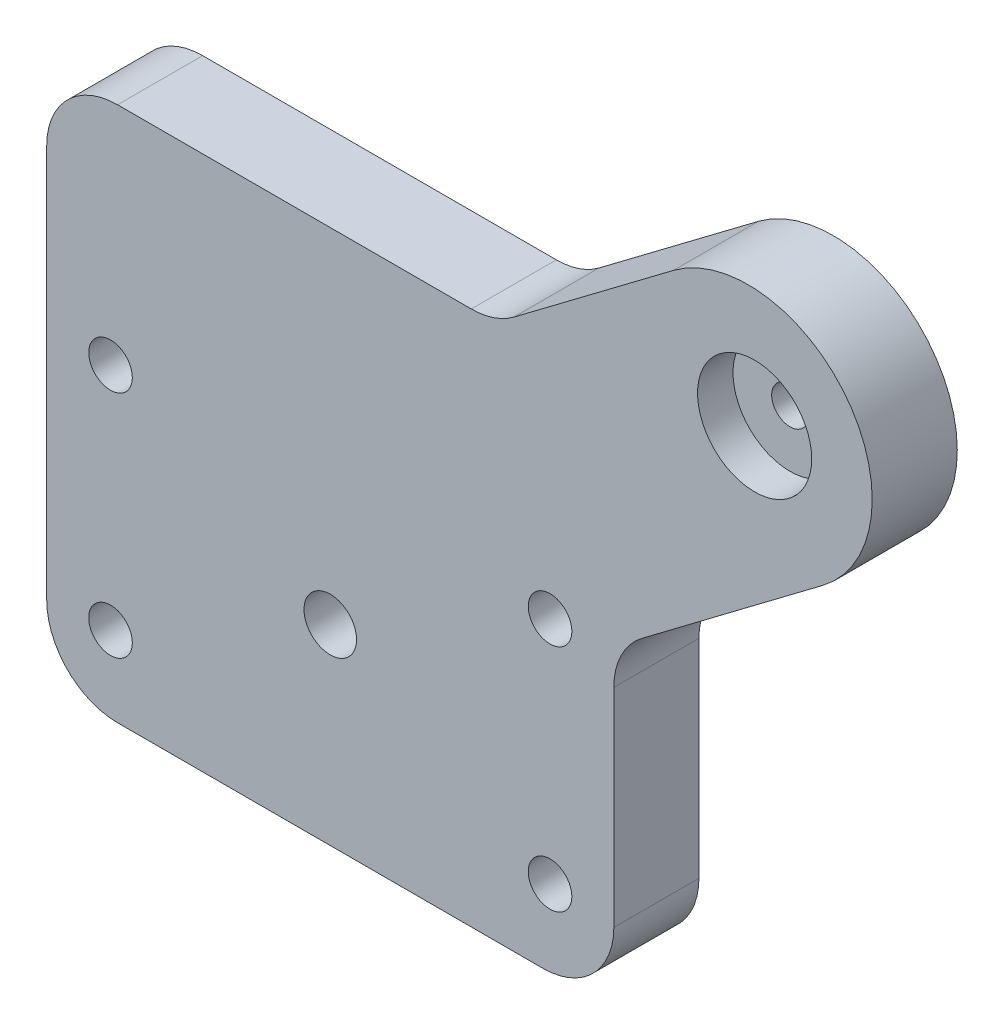
ISO-10303-21;
HEADER;
FILE_DESCRIPTION(('STEP AP214'),'2;1');
FILE_NAME('part.step','',(''),(''),'','','');
FILE_SCHEMA(('AUTOMOTIVE_DESIGN { 1 0 10303 214 1 1 1 1 }'));
ENDSEC;
DATA;
#1=APPLICATION_CONTEXT('core data for automotive mechanical design processes');
#2=APPLICATION_PROTOCOL_DEFINITION('international standard','automotive_design',2000,#1);
#3=PRODUCT_CONTEXT('',#1,'mechanical');
#4=PRODUCT('Part','Part','',(#3));
#5=PRODUCT_RELATED_PRODUCT_CATEGORY('part','',(#4));
#6=PRODUCT_DEFINITION_FORMATION('','',#4);
#7=PRODUCT_DEFINITION_CONTEXT('part definition',#1,'design');
#8=PRODUCT_DEFINITION('design','',#6,#7);
#9=PRODUCT_DEFINITION_SHAPE('','',#8);
#10=(LENGTH_UNIT() NAMED_UNIT(*) SI_UNIT(.MILLI.,.METRE.));
#11=(NAMED_UNIT(*) PLANE_ANGLE_UNIT() SI_UNIT($,.RADIAN.));
#12=(NAMED_UNIT(*) SI_UNIT($,.STERADIAN.) SOLID_ANGLE_UNIT());
#13=UNCERTAINTY_MEASURE_WITH_UNIT(LENGTH_MEASURE(1.E-05),#10,'distance_accuracy_value','');
#14=(GEOMETRIC_REPRESENTATION_CONTEXT(3) GLOBAL_UNCERTAINTY_ASSIGNED_CONTEXT((#13)) GLOBAL_UNIT_ASSIGNED_CONTEXT((#10,
#11,#12)) REPRESENTATION_CONTEXT('',''));
#15=CARTESIAN_POINT('',(0.,0.,0.));
#16=DIRECTION('',(0.,0.,1.));
#17=DIRECTION('',(1.,0.,0.));
#18=AXIS2_PLACEMENT_3D('',#15,#16,#17);
#19=CARTESIAN_POINT('',(58.9473260814253,242.5,14.));
#20=DIRECTION('',(0.,0.,1.));
#21=DIRECTION('',(1.,0.,0.));
#22=AXIS2_PLACEMENT_3D('',#19,#20,#21);
#23=CYLINDRICAL_SURFACE('',#22,17.5000000000002);
#24=CARTESIAN_POINT('',(58.9473260814253,242.5,26.));
#25=DIRECTION('',(0.,0.,1.));
#26=DIRECTION('',(1.,0.,0.));
#27=AXIS2_PLACEMENT_3D('',#24,#25,#26);
#28=CIRCLE('',#27,17.5000000000002);
#29=CARTESIAN_POINT('',(69.4790889865861,228.523878574172,26.));
#30=VERTEX_POINT('',#29);
#31=CARTESIAN_POINT('',(48.4155631762644,256.476121425828,26.));
#32=VERTEX_POINT('',#31);
#33=EDGE_CURVE('E164',#30,#32,#28,.T.);
#34=ORIENTED_EDGE('',*,*,#33,.F.);
#35=DIRECTION('',(0.,0.,1.));
#36=VECTOR('',#35,1.);
#37=CARTESIAN_POINT('',(69.4790889865861,228.523878574172,14.));
#38=LINE('',#37,#36);
#39=CARTESIAN_POINT('',(69.4790889865861,228.523878574172,14.));
#40=VERTEX_POINT('',#39);
#41=EDGE_CURVE('E133',#40,#30,#38,.T.);
#42=ORIENTED_EDGE('',*,*,#41,.F.);
#43=CARTESIAN_POINT('',(58.9473260814253,242.5,14.));
#44=DIRECTION('',(0.,0.,1.));
#45=DIRECTION('',(1.,0.,0.));
#46=AXIS2_PLACEMENT_3D('',#43,#44,#45);
#47=CIRCLE('',#46,17.5000000000002);
#48=CARTESIAN_POINT('',(48.4155631762644,256.476121425828,14.));
#49=VERTEX_POINT('',#48);
#50=EDGE_CURVE('E140',#40,#49,#47,.T.);
#51=ORIENTED_EDGE('',*,*,#50,.T.);
#52=DIRECTION('',(0.,0.,1.));
#53=VECTOR('',#52,1.);
#54=CARTESIAN_POINT('',(48.4155631762644,256.476121425828,14.));
#55=LINE('',#54,#53);
#56=EDGE_CURVE('E122',#49,#32,#55,.T.);
#57=ORIENTED_EDGE('',*,*,#56,.T.);
#58=EDGE_LOOP('',(#34,#42,#51,#57));
#59=FACE_BOUND('',#58,.T.);
#60=ADVANCED_FACE('F33',(#59),#23,.T.);
#61=CARTESIAN_POINT('',(40.0000000000002,206.309791674989,14.));
#62=DIRECTION('',(0.601815023152054,-0.798635510047288,0.));
#63=DIRECTION('',(0.798635510047288,0.601815023152054,0.));
#64=AXIS2_PLACEMENT_3D('',#61,#62,#63);
#65=PLANE('',#64);
#66=DIRECTION('',(0.798635510047288,0.601815023152054,0.));
#67=VECTOR('',#66,1.);
#68=CARTESIAN_POINT('',(40.0000000000002,206.309791674989,26.));
#69=LINE('',#68,#67);
#70=CARTESIAN_POINT('',(43.9818497684796,209.310330694928,26.));
#71=VERTEX_POINT('',#70);
#72=EDGE_CURVE('E145',#71,#30,#69,.T.);
#73=ORIENTED_EDGE('',*,*,#72,.F.);
#74=DIRECTION('',(0.,0.,1.));
#75=VECTOR('',#74,1.);
#76=CARTESIAN_POINT('',(43.9818497684797,209.310330694928,14.));
#77=LINE('',#76,#75);
#78=CARTESIAN_POINT('',(43.9818497684796,209.310330694928,14.));
#79=VERTEX_POINT('',#78);
#80=EDGE_CURVE('E185',#71,#79,#77,.F.);
#81=ORIENTED_EDGE('',*,*,#80,.T.);
#82=DIRECTION('',(0.798635510047288,0.601815023152054,0.));
#83=VECTOR('',#82,1.);
#84=CARTESIAN_POINT('',(40.0000000000002,206.309791674989,14.));
#85=LINE('',#84,#83);
#86=EDGE_CURVE('E134',#79,#40,#85,.T.);
#87=ORIENTED_EDGE('',*,*,#86,.T.);
#88=ORIENTED_EDGE('',*,*,#41,.T.);
#89=EDGE_LOOP('',(#73,#81,#87,#88));
#90=FACE_BOUND('',#89,.T.);
#91=ADVANCED_FACE('F240',(#90),#65,.T.);
#92=CARTESIAN_POINT('',(40.0000000000002,162.,14.));
#93=DIRECTION('',(1.,0.,0.));
#94=DIRECTION('',(0.,0.,-1.));
#95=AXIS2_PLACEMENT_3D('',#92,#93,#94);
#96=PLANE('',#95);
#97=DIRECTION('',(0.,1.,0.));
#98=VECTOR('',#97,1.);
#99=CARTESIAN_POINT('',(40.0000000000002,162.,14.));
#100=LINE('',#99,#98);
#101=CARTESIAN_POINT('',(40.0000000000002,172.,14.));
#102=VERTEX_POINT('',#101);
#103=CARTESIAN_POINT('',(40.0000000000002,201.323975594455,14.));
#104=VERTEX_POINT('',#103);
#105=EDGE_CURVE('E160',#102,#104,#100,.T.);
#106=ORIENTED_EDGE('',*,*,#105,.T.);
#107=DIRECTION('',(0.,0.,1.));
#108=VECTOR('',#107,1.);
#109=CARTESIAN_POINT('',(40.0000000000002,201.323975594455,26.));
#110=LINE('',#109,#108);
#111=CARTESIAN_POINT('',(40.0000000000002,201.323975594455,26.));
#112=VERTEX_POINT('',#111);
#113=EDGE_CURVE('E182',#104,#112,#110,.T.);
#114=ORIENTED_EDGE('',*,*,#113,.T.);
#115=DIRECTION('',(0.,1.,0.));
#116=VECTOR('',#115,1.);
#117=CARTESIAN_POINT('',(40.0000000000002,162.,26.));
#118=LINE('',#117,#116);
#119=CARTESIAN_POINT('',(40.0000000000002,172.,26.));
#120=VERTEX_POINT('',#119);
#121=EDGE_CURVE('E147',#120,#112,#118,.T.);
#122=ORIENTED_EDGE('',*,*,#121,.F.);
#123=DIRECTION('',(0.,0.,1.));
#124=VECTOR('',#123,1.);
#125=CARTESIAN_POINT('',(40.0000000000002,172.,14.));
#126=LINE('',#125,#124);
#127=EDGE_CURVE('E179',#120,#102,#126,.F.);
#128=ORIENTED_EDGE('',*,*,#127,.T.);
#129=EDGE_LOOP('',(#106,#114,#122,#128));
#130=FACE_BOUND('',#129,.T.);
#131=ADVANCED_FACE('F245',(#130),#96,.T.);
#132=CARTESIAN_POINT('',(-40.0000000000002,162.,14.));
#133=DIRECTION('',(0.,-1.,0.));
#134=DIRECTION('',(0.,0.,-1.));
#135=AXIS2_PLACEMENT_3D('',#132,#133,#134);
#136=PLANE('',#135);
#137=DIRECTION('',(1.,0.,0.));
#138=VECTOR('',#137,1.);
#139=CARTESIAN_POINT('',(-40.0000000000002,162.,26.));
#140=LINE('',#139,#138);
#141=CARTESIAN_POINT('',(-30.0000000000002,162.,26.));
#142=VERTEX_POINT('',#141);
#143=CARTESIAN_POINT('',(30.0000000000002,162.,26.));
#144=VERTEX_POINT('',#143);
#145=EDGE_CURVE('E174',#142,#144,#140,.T.);
#146=ORIENTED_EDGE('',*,*,#145,.F.);
#147=DIRECTION('',(0.,0.,1.));
#148=VECTOR('',#147,1.);
#149=CARTESIAN_POINT('',(-30.0000000000002,162.,14.));
#150=LINE('',#149,#148);
#151=CARTESIAN_POINT('',(-30.0000000000002,162.,14.));
#152=VERTEX_POINT('',#151);
#153=EDGE_CURVE('E213',#142,#152,#150,.F.);
#154=ORIENTED_EDGE('',*,*,#153,.T.);
#155=DIRECTION('',(1.,0.,0.));
#156=VECTOR('',#155,1.);
#157=CARTESIAN_POINT('',(-40.0000000000002,162.,14.));
#158=LINE('',#157,#156);
#159=CARTESIAN_POINT('',(30.0000000000002,162.,14.));
#160=VERTEX_POINT('',#159);
#161=EDGE_CURVE('E158',#152,#160,#158,.T.);
#162=ORIENTED_EDGE('',*,*,#161,.T.);
#163=DIRECTION('',(0.,0.,1.));
#164=VECTOR('',#163,1.);
#165=CARTESIAN_POINT('',(30.0000000000002,162.,14.));
#166=LINE('',#165,#164);
#167=EDGE_CURVE('E210',#160,#144,#166,.T.);
#168=ORIENTED_EDGE('',*,*,#167,.T.);
#169=EDGE_LOOP('',(#146,#154,#162,#168));
#170=FACE_BOUND('',#169,.T.);
#171=ADVANCED_FACE('F270',(#170),#136,.T.);
#172=CARTESIAN_POINT('',(-40.0000000000002,237.5,14.));
#173=DIRECTION('',(-1.,0.,0.));
#174=DIRECTION('',(0.,0.,1.));
#175=AXIS2_PLACEMENT_3D('',#172,#173,#174);
#176=PLANE('',#175);
#177=DIRECTION('',(0.,-1.,0.));
#178=VECTOR('',#177,1.);
#179=CARTESIAN_POINT('',(-40.0000000000002,237.5,26.));
#180=LINE('',#179,#178);
#181=CARTESIAN_POINT('',(-40.0000000000002,227.5,26.));
#182=VERTEX_POINT('',#181);
#183=CARTESIAN_POINT('',(-40.0000000000002,172.,26.));
#184=VERTEX_POINT('',#183);
#185=EDGE_CURVE('E171',#182,#184,#180,.T.);
#186=ORIENTED_EDGE('',*,*,#185,.F.);
#187=DIRECTION('',(0.,0.,1.));
#188=VECTOR('',#187,1.);
#189=CARTESIAN_POINT('',(-40.0000000000002,227.5,14.));
#190=LINE('',#189,#188);
#191=CARTESIAN_POINT('',(-40.0000000000002,227.5,14.));
#192=VERTEX_POINT('',#191);
#193=EDGE_CURVE('E201',#182,#192,#190,.F.);
#194=ORIENTED_EDGE('',*,*,#193,.T.);
#195=DIRECTION('',(0.,-1.,0.));
#196=VECTOR('',#195,1.);
#197=CARTESIAN_POINT('',(-40.0000000000002,237.5,14.));
#198=LINE('',#197,#196);
#199=CARTESIAN_POINT('',(-40.0000000000002,172.,14.));
#200=VERTEX_POINT('',#199);
#201=EDGE_CURVE('E155',#192,#200,#198,.T.);
#202=ORIENTED_EDGE('',*,*,#201,.T.);
#203=DIRECTION('',(0.,0.,1.));
#204=VECTOR('',#203,1.);
#205=CARTESIAN_POINT('',(-40.0000000000002,172.,14.));
#206=LINE('',#205,#204);
#207=EDGE_CURVE('E198',#200,#184,#206,.T.);
#208=ORIENTED_EDGE('',*,*,#207,.T.);
#209=EDGE_LOOP('',(#186,#194,#202,#208));
#210=FACE_BOUND('',#209,.T.);
#211=ADVANCED_FACE('F276',(#210),#176,.T.);
#212=CARTESIAN_POINT('',(23.2333995036793,237.5,14.));
#213=DIRECTION('',(0.,1.,0.));
#214=DIRECTION('',(0.,0.,1.));
#215=AXIS2_PLACEMENT_3D('',#212,#213,#214);
#216=PLANE('',#215);
#217=DIRECTION('',(-1.,0.,0.));
#218=VECTOR('',#217,1.);
#219=CARTESIAN_POINT('',(23.2333995036793,237.5,14.));
#220=LINE('',#219,#218);
#221=CARTESIAN_POINT('',(19.8874463086586,237.5,14.));
#222=VERTEX_POINT('',#221);
#223=CARTESIAN_POINT('',(-30.0000000000002,237.5,14.));
#224=VERTEX_POINT('',#223);
#225=EDGE_CURVE('E141',#222,#224,#220,.T.);
#226=ORIENTED_EDGE('',*,*,#225,.T.);
#227=DIRECTION('',(0.,0.,1.));
#228=VECTOR('',#227,1.);
#229=CARTESIAN_POINT('',(-30.0000000000002,237.5,14.));
#230=LINE('',#229,#228);
#231=CARTESIAN_POINT('',(-30.0000000000002,237.5,26.));
#232=VERTEX_POINT('',#231);
#233=EDGE_CURVE('E189',#224,#232,#230,.T.);
#234=ORIENTED_EDGE('',*,*,#233,.T.);
#235=DIRECTION('',(-1.,0.,0.));
#236=VECTOR('',#235,1.);
#237=CARTESIAN_POINT('',(23.2333995036793,237.5,26.));
#238=LINE('',#237,#236);
#239=CARTESIAN_POINT('',(19.8874463086586,237.5,26.));
#240=VERTEX_POINT('',#239);
#241=EDGE_CURVE('E168',#240,#232,#238,.T.);
#242=ORIENTED_EDGE('',*,*,#241,.F.);
#243=DIRECTION('',(0.,0.,1.));
#244=VECTOR('',#243,1.);
#245=CARTESIAN_POINT('',(19.8874463086586,237.5,14.));
#246=LINE('',#245,#244);
#247=EDGE_CURVE('E187',#240,#222,#246,.F.);
#248=ORIENTED_EDGE('',*,*,#247,.T.);
#249=EDGE_LOOP('',(#226,#234,#242,#248));
#250=FACE_BOUND('',#249,.T.);
#251=ADVANCED_FACE('F224',(#250),#216,.T.);
#252=CARTESIAN_POINT('',(48.4155631762644,256.476121425828,14.));
#253=DIRECTION('',(-0.601815023152049,0.798635510047292,0.));
#254=DIRECTION('',(-0.798635510047292,-0.601815023152049,0.));
#255=AXIS2_PLACEMENT_3D('',#252,#253,#254);
#256=PLANE('',#255);
#257=DIRECTION('',(-0.798635510047292,-0.601815023152049,0.));
#258=VECTOR('',#257,1.);
#259=CARTESIAN_POINT('',(48.4155631762644,256.476121425828,14.));
#260=LINE('',#259,#258);
#261=CARTESIAN_POINT('',(25.9055965401791,239.513644899527,14.));
#262=VERTEX_POINT('',#261);
#263=EDGE_CURVE('E125',#49,#262,#260,.T.);
#264=ORIENTED_EDGE('',*,*,#263,.T.);
#265=DIRECTION('',(0.,0.,1.));
#266=VECTOR('',#265,1.);
#267=CARTESIAN_POINT('',(25.9055965401791,239.513644899527,26.));
#268=LINE('',#267,#266);
#269=CARTESIAN_POINT('',(25.9055965401791,239.513644899527,26.));
#270=VERTEX_POINT('',#269);
#271=EDGE_CURVE('E208',#262,#270,#268,.T.);
#272=ORIENTED_EDGE('',*,*,#271,.T.);
#273=DIRECTION('',(-0.798635510047292,-0.601815023152049,0.));
#274=VECTOR('',#273,1.);
#275=CARTESIAN_POINT('',(48.4155631762644,256.476121425828,26.));
#276=LINE('',#275,#274);
#277=EDGE_CURVE('E128',#32,#270,#276,.T.);
#278=ORIENTED_EDGE('',*,*,#277,.F.);
#279=ORIENTED_EDGE('',*,*,#56,.F.);
#280=EDGE_LOOP('',(#264,#272,#278,#279));
#281=FACE_BOUND('',#280,.T.);
#282=ADVANCED_FACE('F123',(#281),#256,.T.);
#283=CARTESIAN_POINT('',(58.9473260814253,242.5,14.));
#284=DIRECTION('',(0.,0.,1.));
#285=DIRECTION('',(1.,0.,0.));
#286=AXIS2_PLACEMENT_3D('',#283,#284,#285);
#287=PLANE('',#286);
#288=CARTESIAN_POINT('',(59.8577432645162,243.186048555602,14.));
#289=DIRECTION('',(0.,0.,1.));
#290=DIRECTION('',(1.,0.,0.));
#291=AXIS2_PLACEMENT_3D('',#288,#289,#290);
#292=CIRCLE('',#291,2.59999999999999);
#293=CARTESIAN_POINT('',(62.4577432645162,243.186048555602,14.));
#294=VERTEX_POINT('',#293);
#295=EDGE_CURVE('E329',#294,#294,#292,.T.);
#296=ORIENTED_EDGE('',*,*,#295,.T.);
#297=EDGE_LOOP('',(#296));
#298=FACE_BOUND('',#297,.T.);
#299=CARTESIAN_POINT('',(30.9999999999999,172.8,14.));
#300=DIRECTION('',(0.,0.,1.));
#301=DIRECTION('',(1.,0.,0.));
#302=AXIS2_PLACEMENT_3D('',#299,#300,#301);
#303=CIRCLE('',#302,3.075);
#304=CARTESIAN_POINT('',(34.0749999999999,172.8,14.));
#305=VERTEX_POINT('',#304);
#306=EDGE_CURVE('E342',#305,#305,#303,.T.);
#307=ORIENTED_EDGE('',*,*,#306,.T.);
#308=EDGE_LOOP('',(#307));
#309=FACE_BOUND('',#308,.T.);
#310=CARTESIAN_POINT('',(-31.0000000000002,205.2,14.));
#311=DIRECTION('',(0.,0.,1.));
#312=DIRECTION('',(1.,0.,0.));
#313=AXIS2_PLACEMENT_3D('',#310,#311,#312);
#314=CIRCLE('',#313,3.075);
#315=CARTESIAN_POINT('',(-27.9250000000002,205.2,14.));
#316=VERTEX_POINT('',#315);
#317=EDGE_CURVE('E348',#316,#316,#314,.T.);
#318=ORIENTED_EDGE('',*,*,#317,.T.);
#319=EDGE_LOOP('',(#318));
#320=FACE_BOUND('',#319,.T.);
#321=CARTESIAN_POINT('',(-31.0000000000001,172.8,14.));
#322=DIRECTION('',(0.,0.,1.));
#323=DIRECTION('',(1.,0.,0.));
#324=AXIS2_PLACEMENT_3D('',#321,#322,#323);
#325=CIRCLE('',#324,3.075);
#326=CARTESIAN_POINT('',(-27.9250000000001,172.8,14.));
#327=VERTEX_POINT('',#326);
#328=EDGE_CURVE('E354',#327,#327,#325,.T.);
#329=ORIENTED_EDGE('',*,*,#328,.T.);
#330=EDGE_LOOP('',(#329));
#331=FACE_BOUND('',#330,.T.);
#332=CARTESIAN_POINT('',(30.9999999999998,205.2,14.));
#333=DIRECTION('',(0.,0.,1.));
#334=DIRECTION('',(1.,0.,0.));
#335=AXIS2_PLACEMENT_3D('',#332,#333,#334);
#336=CIRCLE('',#335,3.075);
#337=CARTESIAN_POINT('',(34.0749999999998,205.2,14.));
#338=VERTEX_POINT('',#337);
#339=EDGE_CURVE('E360',#338,#338,#336,.T.);
#340=ORIENTED_EDGE('',*,*,#339,.T.);
#341=EDGE_LOOP('',(#340));
#342=FACE_BOUND('',#341,.T.);
#343=CARTESIAN_POINT('',(0.,189.,14.));
#344=DIRECTION('',(0.,0.,1.));
#345=DIRECTION('',(1.,0.,0.));
#346=AXIS2_PLACEMENT_3D('',#343,#344,#345);
#347=CIRCLE('',#346,3.706733851603);
#348=CARTESIAN_POINT('',(3.70673385160301,189.,14.));
#349=VERTEX_POINT('',#348);
#350=EDGE_CURVE('E166',#349,#349,#347,.T.);
#351=ORIENTED_EDGE('',*,*,#350,.T.);
#352=EDGE_LOOP('',(#351));
#353=FACE_BOUND('',#352,.T.);
#354=ORIENTED_EDGE('',*,*,#201,.F.);
#355=CARTESIAN_POINT('',(-30.0000000000002,227.5,14.));
#356=DIRECTION('',(0.,0.,1.));
#357=DIRECTION('',(1.,0.,0.));
#358=AXIS2_PLACEMENT_3D('',#355,#356,#357);
#359=CIRCLE('',#358,10.);
#360=EDGE_CURVE('E206',#192,#224,#359,.F.);
#361=ORIENTED_EDGE('',*,*,#360,.T.);
#362=ORIENTED_EDGE('',*,*,#225,.F.);
#363=CARTESIAN_POINT('',(19.8874463086586,247.5,14.));
#364=DIRECTION('',(0.,0.,1.));
#365=DIRECTION('',(1.,0.,0.));
#366=AXIS2_PLACEMENT_3D('',#363,#364,#365);
#367=CIRCLE('',#366,10.);
#368=EDGE_CURVE('E11',#222,#262,#367,.T.);
#369=ORIENTED_EDGE('',*,*,#368,.T.);
#370=ORIENTED_EDGE('',*,*,#263,.F.);
#371=ORIENTED_EDGE('',*,*,#50,.F.);
#372=ORIENTED_EDGE('',*,*,#86,.F.);
#373=CARTESIAN_POINT('',(50.0000000000002,201.323975594455,14.));
#374=DIRECTION('',(0.,0.,1.));
#375=DIRECTION('',(1.,0.,0.));
#376=AXIS2_PLACEMENT_3D('',#373,#374,#375);
#377=CIRCLE('',#376,10.);
#378=EDGE_CURVE('E217',#79,#104,#377,.T.);
#379=ORIENTED_EDGE('',*,*,#378,.T.);
#380=ORIENTED_EDGE('',*,*,#105,.F.);
#381=CARTESIAN_POINT('',(30.0000000000002,172.,14.));
#382=DIRECTION('',(0.,0.,1.));
#383=DIRECTION('',(1.,0.,0.));
#384=AXIS2_PLACEMENT_3D('',#381,#382,#383);
#385=CIRCLE('',#384,10.);
#386=EDGE_CURVE('E53',#102,#160,#385,.F.);
#387=ORIENTED_EDGE('',*,*,#386,.T.);
#388=ORIENTED_EDGE('',*,*,#161,.F.);
#389=CARTESIAN_POINT('',(-30.0000000000002,172.,14.));
#390=DIRECTION('',(0.,0.,1.));
#391=DIRECTION('',(1.,0.,0.));
#392=AXIS2_PLACEMENT_3D('',#389,#390,#391);
#393=CIRCLE('',#392,10.);
#394=EDGE_CURVE('E204',#152,#200,#393,.F.);
#395=ORIENTED_EDGE('',*,*,#394,.T.);
#396=EDGE_LOOP('',(#354,#361,#362,#369,#370,#371,#372,#379,#380,#387,#388,#395));
#397=FACE_BOUND('',#396,.T.);
#398=ADVANCED_FACE('F138',(#298,#309,#320,#331,#342,#353,#397),#287,.F.);
#399=CARTESIAN_POINT('',(58.9473260814253,242.5,26.));
#400=DIRECTION('',(0.,0.,1.));
#401=DIRECTION('',(1.,0.,0.));
#402=AXIS2_PLACEMENT_3D('',#399,#400,#401);
#403=PLANE('',#402);
#404=CARTESIAN_POINT('',(59.8577432645162,243.186048555602,26.));
#405=DIRECTION('',(0.,0.,1.));
#406=DIRECTION('',(1.,0.,0.));
#407=AXIS2_PLACEMENT_3D('',#404,#405,#406);
#408=CIRCLE('',#407,8.05);
#409=CARTESIAN_POINT('',(67.9077432645162,243.186048555602,26.));
#410=VERTEX_POINT('',#409);
#411=EDGE_CURVE('E331',#410,#410,#408,.T.);
#412=ORIENTED_EDGE('',*,*,#411,.F.);
#413=EDGE_LOOP('',(#412));
#414=FACE_BOUND('',#413,.T.);
#415=CARTESIAN_POINT('',(30.9999999999999,172.8,26.));
#416=DIRECTION('',(0.,0.,1.));
#417=DIRECTION('',(1.,0.,0.));
#418=AXIS2_PLACEMENT_3D('',#415,#416,#417);
#419=CIRCLE('',#418,3.07499999999999);
#420=CARTESIAN_POINT('',(34.0749999999999,172.8,26.));
#421=VERTEX_POINT('',#420);
#422=EDGE_CURVE('E337',#421,#421,#419,.T.);
#423=ORIENTED_EDGE('',*,*,#422,.F.);
#424=EDGE_LOOP('',(#423));
#425=FACE_BOUND('',#424,.T.);
#426=CARTESIAN_POINT('',(-31.0000000000002,205.2,26.));
#427=DIRECTION('',(0.,0.,1.));
#428=DIRECTION('',(1.,0.,0.));
#429=AXIS2_PLACEMENT_3D('',#426,#427,#428);
#430=CIRCLE('',#429,3.07499999999999);
#431=CARTESIAN_POINT('',(-27.9250000000002,205.2,26.));
#432=VERTEX_POINT('',#431);
#433=EDGE_CURVE('E345',#432,#432,#430,.T.);
#434=ORIENTED_EDGE('',*,*,#433,.F.);
#435=EDGE_LOOP('',(#434));
#436=FACE_BOUND('',#435,.T.);
#437=CARTESIAN_POINT('',(-31.0000000000001,172.8,26.));
#438=DIRECTION('',(0.,0.,1.));
#439=DIRECTION('',(1.,0.,0.));
#440=AXIS2_PLACEMENT_3D('',#437,#438,#439);
#441=CIRCLE('',#440,3.07499999999999);
#442=CARTESIAN_POINT('',(-27.9250000000001,172.8,26.));
#443=VERTEX_POINT('',#442);
#444=EDGE_CURVE('E351',#443,#443,#441,.T.);
#445=ORIENTED_EDGE('',*,*,#444,.F.);
#446=EDGE_LOOP('',(#445));
#447=FACE_BOUND('',#446,.T.);
#448=CARTESIAN_POINT('',(30.9999999999998,205.2,26.));
#449=DIRECTION('',(0.,0.,1.));
#450=DIRECTION('',(1.,0.,0.));
#451=AXIS2_PLACEMENT_3D('',#448,#449,#450);
#452=CIRCLE('',#451,3.07499999999999);
#453=CARTESIAN_POINT('',(34.0749999999998,205.2,26.));
#454=VERTEX_POINT('',#453);
#455=EDGE_CURVE('E357',#454,#454,#452,.T.);
#456=ORIENTED_EDGE('',*,*,#455,.F.);
#457=EDGE_LOOP('',(#456));
#458=FACE_BOUND('',#457,.T.);
#459=CARTESIAN_POINT('',(0.,189.,26.));
#460=DIRECTION('',(0.,0.,1.));
#461=DIRECTION('',(1.,0.,0.));
#462=AXIS2_PLACEMENT_3D('',#459,#460,#461);
#463=CIRCLE('',#462,3.706733851603);
#464=CARTESIAN_POINT('',(3.70673385160301,189.,26.));
#465=VERTEX_POINT('',#464);
#466=EDGE_CURVE('E150',#465,#465,#463,.T.);
#467=ORIENTED_EDGE('',*,*,#466,.F.);
#468=EDGE_LOOP('',(#467));
#469=FACE_BOUND('',#468,.T.);
#470=ORIENTED_EDGE('',*,*,#241,.T.);
#471=CARTESIAN_POINT('',(-30.0000000000002,227.5,26.));
#472=DIRECTION('',(0.,0.,1.));
#473=DIRECTION('',(1.,0.,0.));
#474=AXIS2_PLACEMENT_3D('',#471,#472,#473);
#475=CIRCLE('',#474,10.);
#476=EDGE_CURVE('E196',#232,#182,#475,.T.);
#477=ORIENTED_EDGE('',*,*,#476,.T.);
#478=ORIENTED_EDGE('',*,*,#185,.T.);
#479=CARTESIAN_POINT('',(-30.0000000000002,172.,26.));
#480=DIRECTION('',(0.,0.,1.));
#481=DIRECTION('',(1.,0.,0.));
#482=AXIS2_PLACEMENT_3D('',#479,#480,#481);
#483=CIRCLE('',#482,10.);
#484=EDGE_CURVE('E194',#184,#142,#483,.T.);
#485=ORIENTED_EDGE('',*,*,#484,.T.);
#486=ORIENTED_EDGE('',*,*,#145,.T.);
#487=CARTESIAN_POINT('',(30.0000000000002,172.,26.));
#488=DIRECTION('',(0.,0.,1.));
#489=DIRECTION('',(1.,0.,0.));
#490=AXIS2_PLACEMENT_3D('',#487,#488,#489);
#491=CIRCLE('',#490,10.);
#492=EDGE_CURVE('E192',#144,#120,#491,.T.);
#493=ORIENTED_EDGE('',*,*,#492,.T.);
#494=ORIENTED_EDGE('',*,*,#121,.T.);
#495=CARTESIAN_POINT('',(50.0000000000002,201.323975594455,26.));
#496=DIRECTION('',(0.,0.,1.));
#497=DIRECTION('',(1.,0.,0.));
#498=AXIS2_PLACEMENT_3D('',#495,#496,#497);
#499=CIRCLE('',#498,10.);
#500=EDGE_CURVE('E215',#112,#71,#499,.F.);
#501=ORIENTED_EDGE('',*,*,#500,.T.);
#502=ORIENTED_EDGE('',*,*,#72,.T.);
#503=ORIENTED_EDGE('',*,*,#33,.T.);
#504=ORIENTED_EDGE('',*,*,#277,.T.);
#505=CARTESIAN_POINT('',(19.8874463086586,247.5,26.));
#506=DIRECTION('',(0.,0.,1.));
#507=DIRECTION('',(1.,0.,0.));
#508=AXIS2_PLACEMENT_3D('',#505,#506,#507);
#509=CIRCLE('',#508,10.);
#510=EDGE_CURVE('E41',#270,#240,#509,.F.);
#511=ORIENTED_EDGE('',*,*,#510,.T.);
#512=EDGE_LOOP('',(#470,#477,#478,#485,#486,#493,#494,#501,#502,#503,#504,#511));
#513=FACE_BOUND('',#512,.T.);
#514=ADVANCED_FACE('F220',(#414,#425,#436,#447,#458,#469,#513),#403,.T.);
#515=CARTESIAN_POINT('',(0.,189.,14.));
#516=DIRECTION('',(0.,0.,1.));
#517=DIRECTION('',(1.,0.,0.));
#518=AXIS2_PLACEMENT_3D('',#515,#516,#517);
#519=CYLINDRICAL_SURFACE('',#518,3.706733851603);
#520=ORIENTED_EDGE('',*,*,#350,.F.);
#521=EDGE_LOOP('',(#520));
#522=FACE_BOUND('',#521,.T.);
#523=ORIENTED_EDGE('',*,*,#466,.T.);
#524=EDGE_LOOP('',(#523));
#525=FACE_BOUND('',#524,.T.);
#526=ADVANCED_FACE('F291',(#522,#525),#519,.F.);
#527=CARTESIAN_POINT('',(30.9999999999998,205.2,26.));
#528=DIRECTION('',(0.,0.,1.));
#529=DIRECTION('',(1.,0.,0.));
#530=AXIS2_PLACEMENT_3D('',#527,#528,#529);
#531=CYLINDRICAL_SURFACE('',#530,3.07499999999999);
#532=ORIENTED_EDGE('',*,*,#339,.F.);
#533=EDGE_LOOP('',(#532));
#534=FACE_BOUND('',#533,.T.);
#535=ORIENTED_EDGE('',*,*,#455,.T.);
#536=EDGE_LOOP('',(#535));
#537=FACE_BOUND('',#536,.T.);
#538=ADVANCED_FACE('F298',(#534,#537),#531,.F.);
#539=CARTESIAN_POINT('',(-31.0000000000001,172.8,26.));
#540=DIRECTION('',(0.,0.,1.));
#541=DIRECTION('',(1.,0.,0.));
#542=AXIS2_PLACEMENT_3D('',#539,#540,#541);
#543=CYLINDRICAL_SURFACE('',#542,3.07499999999999);
#544=ORIENTED_EDGE('',*,*,#328,.F.);
#545=EDGE_LOOP('',(#544));
#546=FACE_BOUND('',#545,.T.);
#547=ORIENTED_EDGE('',*,*,#444,.T.);
#548=EDGE_LOOP('',(#547));
#549=FACE_BOUND('',#548,.T.);
#550=ADVANCED_FACE('F302',(#546,#549),#543,.F.);
#551=CARTESIAN_POINT('',(-31.0000000000002,205.2,26.));
#552=DIRECTION('',(0.,0.,1.));
#553=DIRECTION('',(1.,0.,0.));
#554=AXIS2_PLACEMENT_3D('',#551,#552,#553);
#555=CYLINDRICAL_SURFACE('',#554,3.07499999999999);
#556=ORIENTED_EDGE('',*,*,#317,.F.);
#557=EDGE_LOOP('',(#556));
#558=FACE_BOUND('',#557,.T.);
#559=ORIENTED_EDGE('',*,*,#433,.T.);
#560=EDGE_LOOP('',(#559));
#561=FACE_BOUND('',#560,.T.);
#562=ADVANCED_FACE('F257',(#558,#561),#555,.F.);
#563=CARTESIAN_POINT('',(30.9999999999999,172.8,26.));
#564=DIRECTION('',(0.,0.,1.));
#565=DIRECTION('',(1.,0.,0.));
#566=AXIS2_PLACEMENT_3D('',#563,#564,#565);
#567=CYLINDRICAL_SURFACE('',#566,3.07499999999999);
#568=ORIENTED_EDGE('',*,*,#306,.F.);
#569=EDGE_LOOP('',(#568));
#570=FACE_BOUND('',#569,.T.);
#571=ORIENTED_EDGE('',*,*,#422,.T.);
#572=EDGE_LOOP('',(#571));
#573=FACE_BOUND('',#572,.T.);
#574=ADVANCED_FACE('F252',(#570,#573),#567,.F.);
#575=CARTESIAN_POINT('',(50.0000000000002,201.323975594455,14.));
#576=DIRECTION('',(0.,0.,-1.));
#577=DIRECTION('',(-1.,0.,0.));
#578=AXIS2_PLACEMENT_3D('',#575,#576,#577);
#579=CYLINDRICAL_SURFACE('',#578,10.);
#580=ORIENTED_EDGE('',*,*,#378,.F.);
#581=ORIENTED_EDGE('',*,*,#80,.F.);
#582=ORIENTED_EDGE('',*,*,#500,.F.);
#583=ORIENTED_EDGE('',*,*,#113,.F.);
#584=EDGE_LOOP('',(#580,#581,#582,#583));
#585=FACE_BOUND('',#584,.T.);
#586=ADVANCED_FACE('F236',(#585),#579,.F.);
#587=CARTESIAN_POINT('',(-30.0000000000002,227.5,14.));
#588=DIRECTION('',(0.,0.,1.));
#589=DIRECTION('',(1.,0.,0.));
#590=AXIS2_PLACEMENT_3D('',#587,#588,#589);
#591=CYLINDRICAL_SURFACE('',#590,10.);
#592=ORIENTED_EDGE('',*,*,#360,.F.);
#593=ORIENTED_EDGE('',*,*,#193,.F.);
#594=ORIENTED_EDGE('',*,*,#476,.F.);
#595=ORIENTED_EDGE('',*,*,#233,.F.);
#596=EDGE_LOOP('',(#592,#593,#594,#595));
#597=FACE_BOUND('',#596,.T.);
#598=ADVANCED_FACE('F229',(#597),#591,.T.);
#599=CARTESIAN_POINT('',(19.8874463086586,247.5,14.));
#600=DIRECTION('',(0.,0.,-1.));
#601=DIRECTION('',(-1.,0.,0.));
#602=AXIS2_PLACEMENT_3D('',#599,#600,#601);
#603=CYLINDRICAL_SURFACE('',#602,10.);
#604=ORIENTED_EDGE('',*,*,#368,.F.);
#605=ORIENTED_EDGE('',*,*,#247,.F.);
#606=ORIENTED_EDGE('',*,*,#510,.F.);
#607=ORIENTED_EDGE('',*,*,#271,.F.);
#608=EDGE_LOOP('',(#604,#605,#606,#607));
#609=FACE_BOUND('',#608,.T.);
#610=ADVANCED_FACE('F226',(#609),#603,.F.);
#611=CARTESIAN_POINT('',(-30.0000000000002,172.,14.));
#612=DIRECTION('',(0.,0.,1.));
#613=DIRECTION('',(1.,0.,0.));
#614=AXIS2_PLACEMENT_3D('',#611,#612,#613);
#615=CYLINDRICAL_SURFACE('',#614,10.);
#616=ORIENTED_EDGE('',*,*,#394,.F.);
#617=ORIENTED_EDGE('',*,*,#153,.F.);
#618=ORIENTED_EDGE('',*,*,#484,.F.);
#619=ORIENTED_EDGE('',*,*,#207,.F.);
#620=EDGE_LOOP('',(#616,#617,#618,#619));
#621=FACE_BOUND('',#620,.T.);
#622=ADVANCED_FACE('F228',(#621),#615,.T.);
#623=CARTESIAN_POINT('',(30.0000000000002,172.,14.));
#624=DIRECTION('',(0.,0.,1.));
#625=DIRECTION('',(1.,0.,0.));
#626=AXIS2_PLACEMENT_3D('',#623,#624,#625);
#627=CYLINDRICAL_SURFACE('',#626,10.);
#628=ORIENTED_EDGE('',*,*,#386,.F.);
#629=ORIENTED_EDGE('',*,*,#127,.F.);
#630=ORIENTED_EDGE('',*,*,#492,.F.);
#631=ORIENTED_EDGE('',*,*,#167,.F.);
#632=EDGE_LOOP('',(#628,#629,#630,#631));
#633=FACE_BOUND('',#632,.T.);
#634=ADVANCED_FACE('F35',(#633),#627,.T.);
#635=CARTESIAN_POINT('',(59.8577432645162,243.186048555602,21.));
#636=DIRECTION('',(0.,0.,1.));
#637=DIRECTION('',(1.,0.,0.));
#638=AXIS2_PLACEMENT_3D('',#635,#636,#637);
#639=CYLINDRICAL_SURFACE('',#638,8.05);
#640=CARTESIAN_POINT('',(59.8577432645162,243.186048555602,21.));
#641=DIRECTION('',(0.,0.,1.));
#642=DIRECTION('',(1.,0.,0.));
#643=AXIS2_PLACEMENT_3D('',#640,#641,#642);
#644=CIRCLE('',#643,8.05);
#645=CARTESIAN_POINT('',(67.9077432645162,243.186048555602,21.));
#646=VERTEX_POINT('',#645);
#647=EDGE_CURVE('E334',#646,#646,#644,.T.);
#648=ORIENTED_EDGE('',*,*,#647,.F.);
#649=EDGE_LOOP('',(#648));
#650=FACE_BOUND('',#649,.T.);
#651=ORIENTED_EDGE('',*,*,#411,.T.);
#652=EDGE_LOOP('',(#651));
#653=FACE_BOUND('',#652,.T.);
#654=ADVANCED_FACE('F310',(#650,#653),#639,.F.);
#655=CARTESIAN_POINT('',(59.8577432645162,243.186048555602,21.));
#656=DIRECTION('',(0.,0.,1.));
#657=DIRECTION('',(1.,0.,0.));
#658=AXIS2_PLACEMENT_3D('',#655,#656,#657);
#659=PLANE('',#658);
#660=CARTESIAN_POINT('',(59.8577432645162,243.186048555602,21.));
#661=DIRECTION('',(0.,0.,1.));
#662=DIRECTION('',(1.,0.,0.));
#663=AXIS2_PLACEMENT_3D('',#660,#661,#662);
#664=CIRCLE('',#663,2.59999999999999);
#665=CARTESIAN_POINT('',(62.4577432645162,243.186048555602,21.));
#666=VERTEX_POINT('',#665);
#667=EDGE_CURVE('E326',#666,#666,#664,.T.);
#668=ORIENTED_EDGE('',*,*,#667,.F.);
#669=EDGE_LOOP('',(#668));
#670=FACE_BOUND('',#669,.T.);
#671=ORIENTED_EDGE('',*,*,#647,.T.);
#672=EDGE_LOOP('',(#671));
#673=FACE_BOUND('',#672,.T.);
#674=ADVANCED_FACE('F313',(#670,#673),#659,.T.);
#675=CARTESIAN_POINT('',(59.8577432645162,243.186048555602,14.));
#676=DIRECTION('',(0.,0.,1.));
#677=DIRECTION('',(1.,0.,0.));
#678=AXIS2_PLACEMENT_3D('',#675,#676,#677);
#679=CYLINDRICAL_SURFACE('',#678,2.59999999999999);
#680=ORIENTED_EDGE('',*,*,#667,.T.);
#681=EDGE_LOOP('',(#680));
#682=FACE_BOUND('',#681,.T.);
#683=ORIENTED_EDGE('',*,*,#295,.F.);
#684=EDGE_LOOP('',(#683));
#685=FACE_BOUND('',#684,.T.);
#686=ADVANCED_FACE('F317',(#682,#685),#679,.F.);
#687=CLOSED_SHELL('',(#60,#91,#131,#171,#211,#251,#282,#398,#514,#526,#538,#550,#562,#574,#586,
#598,#610,#622,#634,#654,#674,#686));
#688=MANIFOLD_SOLID_BREP('B2',#687);
#689=ADVANCED_BREP_SHAPE_REPRESENTATION('',(#18,#688),#14);
#690=SHAPE_DEFINITION_REPRESENTATION(#9,#689);
ENDSEC;
END-ISO-10303-21;
